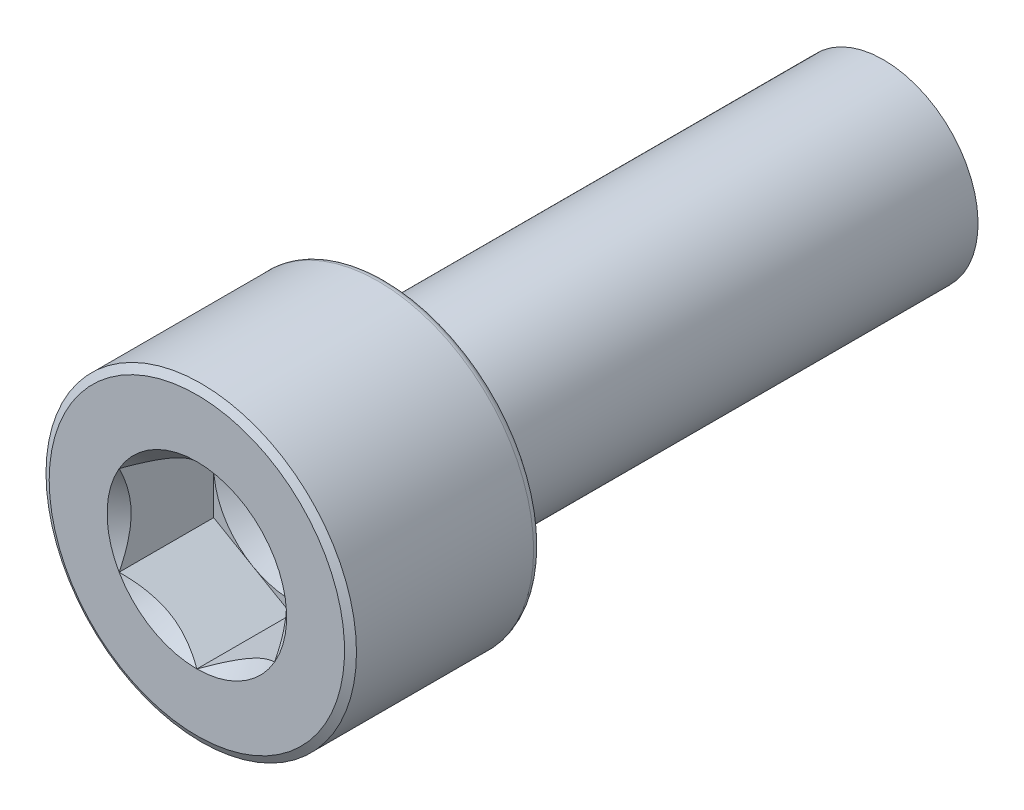
ISO-10303-21;
HEADER;
FILE_DESCRIPTION(('STEP AP214'),'2;1');
FILE_NAME('part.step','',(''),(''),'','','');
FILE_SCHEMA(('AUTOMOTIVE_DESIGN { 1 0 10303 214 1 1 1 1 }'));
ENDSEC;
DATA;
#1=APPLICATION_CONTEXT('core data for automotive mechanical design processes');
#2=APPLICATION_PROTOCOL_DEFINITION('international standard','automotive_design',2000,#1);
#3=PRODUCT_CONTEXT('',#1,'mechanical');
#4=PRODUCT('Part','Part','',(#3));
#5=PRODUCT_RELATED_PRODUCT_CATEGORY('part','',(#4));
#6=PRODUCT_DEFINITION_FORMATION('','',#4);
#7=PRODUCT_DEFINITION_CONTEXT('part definition',#1,'design');
#8=PRODUCT_DEFINITION('design','',#6,#7);
#9=PRODUCT_DEFINITION_SHAPE('','',#8);
#10=(LENGTH_UNIT() NAMED_UNIT(*) SI_UNIT(.MILLI.,.METRE.));
#11=(NAMED_UNIT(*) PLANE_ANGLE_UNIT() SI_UNIT($,.RADIAN.));
#12=(NAMED_UNIT(*) SI_UNIT($,.STERADIAN.) SOLID_ANGLE_UNIT());
#13=UNCERTAINTY_MEASURE_WITH_UNIT(LENGTH_MEASURE(1.E-05),#10,'distance_accuracy_value','');
#14=(GEOMETRIC_REPRESENTATION_CONTEXT(3) GLOBAL_UNCERTAINTY_ASSIGNED_CONTEXT((#13)) GLOBAL_UNIT_ASSIGNED_CONTEXT((#10,
#11,#12)) REPRESENTATION_CONTEXT('',''));
#15=CARTESIAN_POINT('',(0.,0.,0.));
#16=DIRECTION('',(0.,0.,1.));
#17=DIRECTION('',(1.,0.,0.));
#18=AXIS2_PLACEMENT_3D('',#15,#16,#17);
#19=CARTESIAN_POINT('',(1.984375,-3.43703832126949,2.413));
#20=DIRECTION('',(0.,0.,1.));
#21=DIRECTION('',(1.,0.,0.));
#22=AXIS2_PLACEMENT_3D('',#19,#20,#21);
#23=PLANE('',#22);
#24=CARTESIAN_POINT('',(0.,0.,2.413));
#25=DIRECTION('',(0.,0.,1.));
#26=DIRECTION('',(1.,0.,0.));
#27=AXIS2_PLACEMENT_3D('',#24,#25,#26);
#28=CIRCLE('',#27,1.984375);
#29=CARTESIAN_POINT('',(1.984375,0.,2.413));
#30=VERTEX_POINT('',#29);
#31=CARTESIAN_POINT('',(0.992187500000001,1.71851916063475,2.413));
#32=VERTEX_POINT('',#31);
#33=EDGE_CURVE('E52',#30,#32,#28,.T.);
#34=ORIENTED_EDGE('',*,*,#33,.F.);
#35=DIRECTION('',(0.,1.,0.));
#36=VECTOR('',#35,1.);
#37=CARTESIAN_POINT('',(1.984375,-1.14567944042316,2.413));
#38=LINE('',#37,#36);
#39=CARTESIAN_POINT('',(1.98437499999999,1.14567944042319,2.413));
#40=VERTEX_POINT('',#39);
#41=EDGE_CURVE('E122',#30,#40,#38,.T.);
#42=ORIENTED_EDGE('',*,*,#41,.T.);
#43=DIRECTION('',(-0.866025403784439,0.5,0.));
#44=VECTOR('',#43,1.);
#45=CARTESIAN_POINT('',(1.98437499999999,1.14567944042319,2.413));
#46=LINE('',#45,#44);
#47=EDGE_CURVE('E125',#40,#32,#46,.T.);
#48=ORIENTED_EDGE('',*,*,#47,.T.);
#49=EDGE_LOOP('',(#34,#42,#48));
#50=FACE_BOUND('',#49,.T.);
#51=ADVANCED_FACE('F35',(#50),#23,.T.);
#52=CARTESIAN_POINT('',(-0.9921875,1.71851916063475,2.413));
#53=VERTEX_POINT('',#52);
#54=EDGE_CURVE('E11',#32,#53,#28,.T.);
#55=ORIENTED_EDGE('',*,*,#54,.F.);
#56=CARTESIAN_POINT('',(0.,2.29135888084634,2.413));
#57=VERTEX_POINT('',#56);
#58=EDGE_CURVE('E139',#32,#57,#46,.T.);
#59=ORIENTED_EDGE('',*,*,#58,.T.);
#60=DIRECTION('',(-0.866025403784439,-0.499999999999999,0.));
#61=VECTOR('',#60,1.);
#62=CARTESIAN_POINT('',(0.,2.29135888084634,2.413));
#63=LINE('',#62,#61);
#64=EDGE_CURVE('E145',#57,#53,#63,.T.);
#65=ORIENTED_EDGE('',*,*,#64,.T.);
#66=EDGE_LOOP('',(#55,#59,#65));
#67=FACE_BOUND('',#66,.T.);
#68=ADVANCED_FACE('F303',(#67),#23,.T.);
#69=CARTESIAN_POINT('',(-1.984375,0.,2.413));
#70=VERTEX_POINT('',#69);
#71=EDGE_CURVE('E50',#53,#70,#28,.T.);
#72=ORIENTED_EDGE('',*,*,#71,.F.);
#73=CARTESIAN_POINT('',(-1.98437500000001,1.14567944042318,2.413));
#74=VERTEX_POINT('',#73);
#75=EDGE_CURVE('E144',#53,#74,#63,.T.);
#76=ORIENTED_EDGE('',*,*,#75,.T.);
#77=DIRECTION('',(0.,-1.,0.));
#78=VECTOR('',#77,1.);
#79=CARTESIAN_POINT('',(-1.98437500000001,1.14567944042318,2.413));
#80=LINE('',#79,#78);
#81=EDGE_CURVE('E149',#74,#70,#80,.T.);
#82=ORIENTED_EDGE('',*,*,#81,.T.);
#83=EDGE_LOOP('',(#72,#76,#82));
#84=FACE_BOUND('',#83,.T.);
#85=ADVANCED_FACE('F307',(#84),#23,.T.);
#86=CARTESIAN_POINT('',(-0.9921875,-1.71851916063475,2.413));
#87=VERTEX_POINT('',#86);
#88=EDGE_CURVE('E320',#70,#87,#28,.T.);
#89=ORIENTED_EDGE('',*,*,#88,.F.);
#90=CARTESIAN_POINT('',(-1.984375,-1.14567944042316,2.413));
#91=VERTEX_POINT('',#90);
#92=EDGE_CURVE('E148',#70,#91,#80,.T.);
#93=ORIENTED_EDGE('',*,*,#92,.T.);
#94=DIRECTION('',(0.866025403784439,-0.499999999999999,0.));
#95=VECTOR('',#94,1.);
#96=CARTESIAN_POINT('',(-1.984375,-1.14567944042316,2.413));
#97=LINE('',#96,#95);
#98=EDGE_CURVE('E242',#91,#87,#97,.T.);
#99=ORIENTED_EDGE('',*,*,#98,.T.);
#100=EDGE_LOOP('',(#89,#93,#99));
#101=FACE_BOUND('',#100,.T.);
#102=ADVANCED_FACE('F312',(#101),#23,.T.);
#103=CARTESIAN_POINT('',(0.992187499999994,-1.71851916063474,2.413));
#104=VERTEX_POINT('',#103);
#105=EDGE_CURVE('E59',#87,#104,#28,.T.);
#106=ORIENTED_EDGE('',*,*,#105,.F.);
#107=CARTESIAN_POINT('',(0.,-2.29135888084632,2.413));
#108=VERTEX_POINT('',#107);
#109=EDGE_CURVE('E226',#87,#108,#97,.T.);
#110=ORIENTED_EDGE('',*,*,#109,.T.);
#111=DIRECTION('',(0.866025403784439,0.499999999999999,0.));
#112=VECTOR('',#111,1.);
#113=CARTESIAN_POINT('',(0.,-2.29135888084632,2.413));
#114=LINE('',#113,#112);
#115=EDGE_CURVE('E134',#108,#104,#114,.T.);
#116=ORIENTED_EDGE('',*,*,#115,.T.);
#117=EDGE_LOOP('',(#106,#110,#116));
#118=FACE_BOUND('',#117,.T.);
#119=ADVANCED_FACE('F301',(#118),#23,.T.);
#120=CARTESIAN_POINT('',(0.,0.,0.));
#121=DIRECTION('',(0.,0.,-1.));
#122=DIRECTION('',(0.,1.,0.));
#123=AXIS2_PLACEMENT_3D('',#120,#121,#122);
#124=CYLINDRICAL_SURFACE('',#123,2.413);
#125=CARTESIAN_POINT('',(0.,0.,0.));
#126=DIRECTION('',(0.,0.,1.));
#127=DIRECTION('',(1.,0.,0.));
#128=AXIS2_PLACEMENT_3D('',#125,#126,#127);
#129=CIRCLE('',#128,2.413);
#130=CARTESIAN_POINT('',(2.413,0.,0.));
#131=VERTEX_POINT('',#130);
#132=EDGE_CURVE('E156',#131,#131,#129,.F.);
#133=ORIENTED_EDGE('',*,*,#132,.T.);
#134=EDGE_LOOP('',(#133));
#135=FACE_BOUND('',#134,.T.);
#136=CARTESIAN_POINT('',(0.,0.,-12.7));
#137=DIRECTION('',(0.,0.,-1.));
#138=DIRECTION('',(0.,1.,0.));
#139=AXIS2_PLACEMENT_3D('',#136,#137,#138);
#140=CIRCLE('',#139,2.413);
#141=CARTESIAN_POINT('',(0.,2.413,-12.7));
#142=VERTEX_POINT('',#141);
#143=EDGE_CURVE('E170',#142,#142,#140,.T.);
#144=ORIENTED_EDGE('',*,*,#143,.F.);
#145=EDGE_LOOP('',(#144));
#146=FACE_BOUND('',#145,.T.);
#147=ADVANCED_FACE('F324',(#135,#146),#124,.T.);
#148=CARTESIAN_POINT('',(0.,0.,-12.7));
#149=DIRECTION('',(0.,0.,-1.));
#150=DIRECTION('',(0.,1.,0.));
#151=AXIS2_PLACEMENT_3D('',#148,#149,#150);
#152=PLANE('',#151);
#153=ORIENTED_EDGE('',*,*,#143,.T.);
#154=EDGE_LOOP('',(#153));
#155=FACE_BOUND('',#154,.T.);
#156=ADVANCED_FACE('F329',(#155),#152,.T.);
#157=CARTESIAN_POINT('',(0.,0.,4.826));
#158=DIRECTION('',(0.,0.,-1.));
#159=DIRECTION('',(-1.,0.,0.));
#160=AXIS2_PLACEMENT_3D('',#157,#158,#159);
#161=CYLINDRICAL_SURFACE('',#160,3.9624);
#162=CARTESIAN_POINT('',(0.,0.,4.71454830403563));
#163=DIRECTION('',(0.,0.,1.));
#164=DIRECTION('',(1.,0.,0.));
#165=AXIS2_PLACEMENT_3D('',#162,#163,#164);
#166=CIRCLE('',#165,3.9624);
#167=CARTESIAN_POINT('',(-3.9624,0.,4.71454830403563));
#168=VERTEX_POINT('',#167);
#169=EDGE_CURVE('E181',#168,#168,#166,.F.);
#170=ORIENTED_EDGE('',*,*,#169,.T.);
#171=EDGE_LOOP('',(#170));
#172=FACE_BOUND('',#171,.T.);
#173=CARTESIAN_POINT('',(0.,0.,0.19304));
#174=DIRECTION('',(0.,0.,1.));
#175=DIRECTION('',(1.,0.,0.));
#176=AXIS2_PLACEMENT_3D('',#173,#174,#175);
#177=CIRCLE('',#176,3.9624);
#178=CARTESIAN_POINT('',(3.9624,0.,0.19304));
#179=VERTEX_POINT('',#178);
#180=EDGE_CURVE('E173',#179,#179,#177,.T.);
#181=ORIENTED_EDGE('',*,*,#180,.T.);
#182=EDGE_LOOP('',(#181));
#183=FACE_BOUND('',#182,.T.);
#184=ADVANCED_FACE('F403',(#172,#183),#161,.T.);
#185=CARTESIAN_POINT('',(0.,0.,4.826));
#186=DIRECTION('',(0.,0.,1.));
#187=DIRECTION('',(1.,0.,0.));
#188=AXIS2_PLACEMENT_3D('',#185,#186,#187);
#189=PLANE('',#188);
#190=CARTESIAN_POINT('',(0.,0.,4.826));
#191=DIRECTION('',(0.,0.,1.));
#192=DIRECTION('',(1.,0.,0.));
#193=AXIS2_PLACEMENT_3D('',#190,#191,#192);
#194=CIRCLE('',#193,2.29135888084632);
#195=CARTESIAN_POINT('',(1.98437499999999,1.14567944042316,4.826));
#196=VERTEX_POINT('',#195);
#197=CARTESIAN_POINT('',(0.,2.29135888084632,4.826));
#198=VERTEX_POINT('',#197);
#199=EDGE_CURVE('E209',#196,#198,#194,.T.);
#200=ORIENTED_EDGE('',*,*,#199,.F.);
#201=CARTESIAN_POINT('',(1.984375,-1.14567944042316,4.826));
#202=VERTEX_POINT('',#201);
#203=EDGE_CURVE('E202',#202,#196,#194,.T.);
#204=ORIENTED_EDGE('',*,*,#203,.F.);
#205=CARTESIAN_POINT('',(0.,-2.29135888084632,4.826));
#206=VERTEX_POINT('',#205);
#207=EDGE_CURVE('E195',#206,#202,#194,.T.);
#208=ORIENTED_EDGE('',*,*,#207,.F.);
#209=CARTESIAN_POINT('',(-1.984375,-1.14567944042314,4.826));
#210=VERTEX_POINT('',#209);
#211=EDGE_CURVE('E201',#210,#206,#194,.T.);
#212=ORIENTED_EDGE('',*,*,#211,.F.);
#213=CARTESIAN_POINT('',(-1.98437499999997,1.1456794404232,4.826));
#214=VERTEX_POINT('',#213);
#215=EDGE_CURVE('E66',#214,#210,#194,.T.);
#216=ORIENTED_EDGE('',*,*,#215,.F.);
#217=EDGE_CURVE('E217',#198,#214,#194,.T.);
#218=ORIENTED_EDGE('',*,*,#217,.F.);
#219=EDGE_LOOP('',(#200,#204,#208,#212,#216,#218));
#220=FACE_BOUND('',#219,.T.);
#221=CARTESIAN_POINT('',(0.,0.,4.826));
#222=DIRECTION('',(0.,0.,1.));
#223=DIRECTION('',(1.,0.,0.));
#224=AXIS2_PLACEMENT_3D('',#221,#222,#223);
#225=CIRCLE('',#224,3.76936);
#226=CARTESIAN_POINT('',(-3.76936,0.,4.826));
#227=VERTEX_POINT('',#226);
#228=EDGE_CURVE('E179',#227,#227,#225,.T.);
#229=ORIENTED_EDGE('',*,*,#228,.T.);
#230=EDGE_LOOP('',(#229));
#231=FACE_BOUND('',#230,.T.);
#232=ADVANCED_FACE('F212',(#220,#231),#189,.T.);
#233=CARTESIAN_POINT('',(0.,0.,0.));
#234=DIRECTION('',(0.,0.,1.));
#235=DIRECTION('',(1.,0.,0.));
#236=AXIS2_PLACEMENT_3D('',#233,#234,#235);
#237=PLANE('',#236);
#238=CARTESIAN_POINT('',(0.,0.,0.));
#239=DIRECTION('',(0.,0.,1.));
#240=DIRECTION('',(1.,0.,0.));
#241=AXIS2_PLACEMENT_3D('',#238,#239,#240);
#242=CIRCLE('',#241,3.76936);
#243=CARTESIAN_POINT('',(3.76936,0.,0.));
#244=VERTEX_POINT('',#243);
#245=EDGE_CURVE('E176',#244,#244,#242,.F.);
#246=ORIENTED_EDGE('',*,*,#245,.T.);
#247=EDGE_LOOP('',(#246));
#248=FACE_BOUND('',#247,.T.);
#249=ORIENTED_EDGE('',*,*,#132,.F.);
#250=EDGE_LOOP('',(#249));
#251=FACE_BOUND('',#250,.T.);
#252=ADVANCED_FACE('F402',(#248,#251),#237,.F.);
#253=CARTESIAN_POINT('',(0.,0.,0.19304));
#254=DIRECTION('',(0.,0.,1.));
#255=DIRECTION('',(1.,0.,0.));
#256=AXIS2_PLACEMENT_3D('',#253,#254,#255);
#257=TOROIDAL_SURFACE('',#256,3.76936,0.19304);
#258=ORIENTED_EDGE('',*,*,#245,.F.);
#259=EDGE_LOOP('',(#258));
#260=FACE_BOUND('',#259,.T.);
#261=ORIENTED_EDGE('',*,*,#180,.F.);
#262=EDGE_LOOP('',(#261));
#263=FACE_BOUND('',#262,.T.);
#264=ADVANCED_FACE('F414',(#260,#263),#257,.T.);
#265=CARTESIAN_POINT('',(0.,0.,4.826));
#266=DIRECTION('',(0.,0.,-1.));
#267=DIRECTION('',(-1.,0.,0.));
#268=AXIS2_PLACEMENT_3D('',#265,#266,#267);
#269=CONICAL_SURFACE('',#268,3.76936,1.0471975511966);
#270=CARTESIAN_POINT('',(-3.9624,0.,4.71454830403563));
#271=CARTESIAN_POINT('',(-3.96038916666667,0.,4.71570925920193));
#272=CARTESIAN_POINT('',(-3.95837833333333,0.,4.71687021436822));
#273=CARTESIAN_POINT('',(-3.95435666666667,0.,4.71919212470081));
#274=CARTESIAN_POINT('',(-3.95234583333333,0.,4.72035307986711));
#275=CARTESIAN_POINT('',(-3.94832416666667,0.,4.7226749901997));
#276=CARTESIAN_POINT('',(-3.94631333333333,0.,4.723835945366));
#277=CARTESIAN_POINT('',(-3.94229166666667,0.,4.72615785569859));
#278=CARTESIAN_POINT('',(-3.94028083333333,0.,4.72731881086488));
#279=CARTESIAN_POINT('',(-3.93625916666667,0.,4.72964072119747));
#280=CARTESIAN_POINT('',(-3.93424833333333,0.,4.73080167636377));
#281=CARTESIAN_POINT('',(-3.93022666666667,0.,4.73312358669636));
#282=CARTESIAN_POINT('',(-3.92821583333333,0.,4.73428454186266));
#283=CARTESIAN_POINT('',(-3.92419416666667,0.,4.73660645219525));
#284=CARTESIAN_POINT('',(-3.92218333333333,0.,4.73776740736154));
#285=CARTESIAN_POINT('',(-3.91816166666667,0.,4.74008931769413));
#286=CARTESIAN_POINT('',(-3.91615083333333,0.,4.74125027286043));
#287=CARTESIAN_POINT('',(-3.91212916666667,0.,4.74357218319302));
#288=CARTESIAN_POINT('',(-3.91011833333333,0.,4.74473313835931));
#289=CARTESIAN_POINT('',(-3.90609666666667,0.,4.74705504869191));
#290=CARTESIAN_POINT('',(-3.90408583333333,0.,4.7482160038582));
#291=CARTESIAN_POINT('',(-3.90006416666667,0.,4.75053791419079));
#292=CARTESIAN_POINT('',(-3.89805333333333,0.,4.75169886935709));
#293=CARTESIAN_POINT('',(-3.89403166666667,0.,4.75402077968968));
#294=CARTESIAN_POINT('',(-3.89202083333333,0.,4.75518173485597));
#295=CARTESIAN_POINT('',(-3.88799916666667,0.,4.75750364518857));
#296=CARTESIAN_POINT('',(-3.88598833333333,0.,4.75866460035486));
#297=CARTESIAN_POINT('',(-3.88196666666667,0.,4.76098651068745));
#298=CARTESIAN_POINT('',(-3.87995583333333,0.,4.76214746585375));
#299=CARTESIAN_POINT('',(-3.87593416666667,0.,4.76446937618634));
#300=CARTESIAN_POINT('',(-3.87392333333333,0.,4.76563033135263));
#301=CARTESIAN_POINT('',(-3.86990166666667,0.,4.76795224168522));
#302=CARTESIAN_POINT('',(-3.86789083333333,0.,4.76911319685152));
#303=CARTESIAN_POINT('',(-3.86386916666667,0.,4.77143510718411));
#304=CARTESIAN_POINT('',(-3.86185833333333,0.,4.77259606235041));
#305=CARTESIAN_POINT('',(-3.85783666666667,0.,4.774917972683));
#306=CARTESIAN_POINT('',(-3.85582583333333,0.,4.77607892784929));
#307=CARTESIAN_POINT('',(-3.85180416666667,0.,4.77840083818188));
#308=CARTESIAN_POINT('',(-3.84979333333333,0.,4.77956179334818));
#309=CARTESIAN_POINT('',(-3.84577166666667,0.,4.78188370368077));
#310=CARTESIAN_POINT('',(-3.84376083333333,0.,4.78304465884707));
#311=CARTESIAN_POINT('',(-3.83973916666667,0.,4.78536656917966));
#312=CARTESIAN_POINT('',(-3.83772833333333,0.,4.78652752434595));
#313=CARTESIAN_POINT('',(-3.83370666666667,0.,4.78884943467854));
#314=CARTESIAN_POINT('',(-3.83169583333333,0.,4.79001038984484));
#315=CARTESIAN_POINT('',(-3.82767416666667,0.,4.79233230017743));
#316=CARTESIAN_POINT('',(-3.82566333333333,0.,4.79349325534373));
#317=CARTESIAN_POINT('',(-3.82164166666667,0.,4.79581516567632));
#318=CARTESIAN_POINT('',(-3.81963083333333,0.,4.79697612084261));
#319=CARTESIAN_POINT('',(-3.81560916666667,0.,4.7992980311752));
#320=CARTESIAN_POINT('',(-3.81359833333333,0.,4.8004589863415));
#321=CARTESIAN_POINT('',(-3.80957666666667,0.,4.80278089667409));
#322=CARTESIAN_POINT('',(-3.80756583333333,0.,4.80394185184038));
#323=CARTESIAN_POINT('',(-3.80354416666667,0.,4.80626376217298));
#324=CARTESIAN_POINT('',(-3.80153333333333,0.,4.80742471733927));
#325=CARTESIAN_POINT('',(-3.79751166666667,0.,4.80974662767186));
#326=CARTESIAN_POINT('',(-3.79550083333333,0.,4.81090758283816));
#327=CARTESIAN_POINT('',(-3.79147916666667,0.,4.81322949317075));
#328=CARTESIAN_POINT('',(-3.78946833333333,0.,4.81439044833704));
#329=CARTESIAN_POINT('',(-3.78544666666667,0.,4.81671235866964));
#330=CARTESIAN_POINT('',(-3.78343583333333,0.,4.81787331383593));
#331=CARTESIAN_POINT('',(-3.77941416666667,0.,4.82019522416852));
#332=CARTESIAN_POINT('',(-3.77740333333333,0.,4.82135617933482));
#333=CARTESIAN_POINT('',(-3.77338166666667,0.,4.82367808966741));
#334=CARTESIAN_POINT('',(-3.77137083333333,0.,4.8248390448337));
#335=CARTESIAN_POINT('',(-3.76936,0.,4.826));
#336=B_SPLINE_CURVE_WITH_KNOTS('',3,(#270,#271,#272,#273,#274,#275,#276,#277,#278,#279,#280,
#281,#282,#283,#284,#285,#286,#287,#288,#289,#290,#291,#292,#293,#294,#295,#296,#297,#298,#299,
#300,#301,#302,#303,#304,#305,#306,#307,#308,#309,#310,#311,#312,#313,#314,#315,#316,#317,#318,
#319,#320,#321,#322,#323,#324,#325,#326,#327,#328,#329,#330,#331,#332,#333,#334,#335),
.UNSPECIFIED.,.F.,.F.,(4,2,2,2,2,2,2,2,2,2,2,2,2,2,2,2,2,2,2,2,2,2,2,2,2,2,2,2,2,2,2,2,4),(0.,
0.00696573099777281,0.0139314619955456,0.0208971929933188,0.0278629239910909,0.0348286549888641,
0.0417943859866369,0.0487601169844102,0.055725847982183,0.0626915789799558,0.0696573099777286,
0.0766230409755015,0.0835887719732743,0.0905545029710471,0.0975202339688204,0.104485964966593,
0.111451695964366,0.118417426962139,0.125383157959912,0.132348888957685,0.139314619955457,
0.146280350953231,0.153246081951003,0.160211812948776,0.167177543946549,0.174143274944321,
0.181109005942095,0.188074736939868,0.195040467937641,0.202006198935413,0.208971929933186,
0.215937660930959,0.222903391928732),.UNSPECIFIED.);
#337=EDGE_CURVE('BSEAM37',#168,#227,#336,.T.);
#338=ORIENTED_EDGE('',*,*,#169,.F.);
#339=ORIENTED_EDGE('',*,*,#228,.F.);
#340=ORIENTED_EDGE('',*,*,#337,.T.);
#341=ORIENTED_EDGE('',*,*,#337,.F.);
#342=EDGE_LOOP('',(#338,#340,#339,#341));
#343=FACE_BOUND('',#342,.T.);
#344=ADVANCED_FACE('F37',(#343),#269,.T.);
#345=CARTESIAN_POINT('',(0.,0.,4.826));
#346=DIRECTION('',(0.,0.,1.));
#347=DIRECTION('',(1.,0.,0.));
#348=AXIS2_PLACEMENT_3D('',#345,#346,#347);
#349=CONICAL_SURFACE('',#348,2.29135888084632,0.78539816339745);
#350=ORIENTED_EDGE('',*,*,#207,.T.);
#351=CARTESIAN_POINT('',(-0.000200000000006322,-2.29147435090016,4.82611547878184));
#352=CARTESIAN_POINT('',(0.0680159951667959,-2.25208982772757,4.78676285226391));
#353=CARTESIAN_POINT('',(0.137372685106959,-2.21204672412051,4.74972131044618));
#354=CARTESIAN_POINT('',(0.278798800452181,-2.1303943183555,4.68189885842332));
#355=CARTESIAN_POINT('',(0.350881678736776,-2.08877724917393,4.65115568909175));
#356=CARTESIAN_POINT('',(0.496233397265998,-2.00485839535391,4.59849188881121));
#357=CARTESIAN_POINT('',(0.569465212486932,-1.96257798712286,4.57643887587996));
#358=CARTESIAN_POINT('',(0.7175411825947,-1.87708628592062,4.54246149294387));
#359=CARTESIAN_POINT('',(0.792380812753419,-1.83387760530244,4.53051175609173));
#360=CARTESIAN_POINT('',(0.92136041454381,-1.75941119748878,4.5197300990819));
#361=CARTESIAN_POINT('',(0.975333715772437,-1.72824969749538,4.51813389905907));
#362=CARTESIAN_POINT('',(1.08319211851979,-1.66597761963483,4.52082183886529));
#363=CARTESIAN_POINT('',(1.13707718248552,-1.63486706344892,4.52510804034046));
#364=CARTESIAN_POINT('',(1.2443385382486,-1.57293969082546,4.53931687301352));
#365=CARTESIAN_POINT('',(1.29771419276013,-1.54212324232506,4.54924581045227));
#366=CARTESIAN_POINT('',(1.40354251740889,-1.48102323060121,4.57419508427454));
#367=CARTESIAN_POINT('',(1.45599525797109,-1.45073962671789,4.58921503038949));
#368=CARTESIAN_POINT('',(1.59035733896364,-1.37316564308796,4.63380785163567));
#369=CARTESIAN_POINT('',(1.67143335715832,-1.32635638215844,4.66674299593833));
#370=CARTESIAN_POINT('',(1.79064830672983,-1.2575275989319,4.7223424412022));
#371=CARTESIAN_POINT('',(1.829934924386,-1.23484545965257,4.74187759205186));
#372=CARTESIAN_POINT('',(1.90778036186805,-1.18990137536712,4.7827287381194));
#373=CARTESIAN_POINT('',(1.94633961110169,-1.16763918244232,4.80404363956835));
#374=CARTESIAN_POINT('',(1.984575,-1.14556397036932,4.82611547878184));
#375=B_SPLINE_CURVE_WITH_KNOTS('',3,(#351,#352,#353,#354,#355,#356,#357,#358,#359,#360,#361,
#362,#363,#364,#365,#366,#367,#368,#369,#370,#371,#372,#373,#374),.UNSPECIFIED.,.F.,.F.,(4,2,2,
2,2,2,2,2,2,2,2,4),(0.,0.264339630306627,0.530219665093694,0.791876416371461,1.05287424418109,
1.239639843932,1.42647091743852,1.61351120244035,1.8005371524754,2.09764209964316,
2.24579179873714,2.39385111134157),.UNSPECIFIED.);
#376=EDGE_CURVE('E39',#206,#202,#375,.T.);
#377=ORIENTED_EDGE('',*,*,#376,.F.);
#378=EDGE_LOOP('',(#350,#377));
#379=FACE_BOUND('',#378,.T.);
#380=ADVANCED_FACE('F197',(#379),#349,.F.);
#381=ORIENTED_EDGE('',*,*,#203,.T.);
#382=CARTESIAN_POINT('',(1.984375,-2.28495242191065,5.56098407906757));
#383=CARTESIAN_POINT('',(1.984375,-2.22931635487712,5.51898668579209));
#384=CARTESIAN_POINT('',(1.984375,-2.17336876579764,5.47739605430801));
#385=CARTESIAN_POINT('',(1.984375,-2.06072770287665,5.39520846168391));
#386=CARTESIAN_POINT('',(1.984375,-2.00403404531983,5.35461175260787));
#387=CARTESIAN_POINT('',(1.984375,-1.88936329200115,5.27430350335824));
#388=CARTESIAN_POINT('',(1.984375,-1.83137965544998,5.23460125898722));
#389=CARTESIAN_POINT('',(1.984375,-1.71442802161517,5.15668517355603));
#390=CARTESIAN_POINT('',(1.984375,-1.6554600942991,5.11847122733961));
#391=CARTESIAN_POINT('',(1.984375,-1.47005472325434,5.0022528341287));
#392=CARTESIAN_POINT('',(1.984375,-1.34163909444948,4.92734788696727));
#393=CARTESIAN_POINT('',(1.984375,-1.07840384717677,4.79033021549721));
#394=CARTESIAN_POINT('',(1.984375,-0.943607781504087,4.72817436652259));
#395=CARTESIAN_POINT('',(1.984375,-0.7412751005225,4.65213257871602));
#396=CARTESIAN_POINT('',(1.984375,-0.676735408966689,4.63030806135391));
#397=CARTESIAN_POINT('',(1.984375,-0.546098118214568,4.59184046356508));
#398=CARTESIAN_POINT('',(1.984375,-0.480000412029999,4.57519774009172));
#399=CARTESIAN_POINT('',(1.984375,-0.347746170154777,4.5482353808918));
#400=CARTESIAN_POINT('',(1.984375,-0.28161207161333,4.53780740975504));
#401=CARTESIAN_POINT('',(1.984375,-0.148636620202213,4.52347814738807));
#402=CARTESIAN_POINT('',(1.98437499999999,-0.0817953908968818,4.51957573423413));
#403=CARTESIAN_POINT('',(1.98437499999999,0.0495156749173089,4.51858705132861));
#404=CARTESIAN_POINT('',(1.98437499999999,0.113983774924714,4.52125917886497));
#405=CARTESIAN_POINT('',(1.98437499999999,0.242367515655507,4.53273921047457));
#406=CARTESIAN_POINT('',(1.98437499999999,0.306283102099379,4.54154771060935));
#407=CARTESIAN_POINT('',(1.98437499999999,0.434181040054056,4.56496902128854));
#408=CARTESIAN_POINT('',(1.98437499999999,0.498145026644481,4.57968060618011));
#409=CARTESIAN_POINT('',(1.98437499999999,0.624675616728328,4.61412618134473));
#410=CARTESIAN_POINT('',(1.98437499999999,0.687242336669859,4.63385975137401));
#411=CARTESIAN_POINT('',(1.98437499999999,0.884225483546212,4.70341223711885));
#412=CARTESIAN_POINT('',(1.98437499999999,1.01583674224242,4.7611524111108));
#413=CARTESIAN_POINT('',(1.98437499999999,1.27288659202273,4.88953033637179));
#414=CARTESIAN_POINT('',(1.98437499999999,1.3983008822619,4.96021442466487));
#415=CARTESIAN_POINT('',(1.98437499999999,1.57956687940504,5.07051666350364));
#416=CARTESIAN_POINT('',(1.98437499999999,1.63738271248118,5.10696982914889));
#417=CARTESIAN_POINT('',(1.98437499999999,1.75202215331741,5.18141596293131));
#418=CARTESIAN_POINT('',(1.98437499999999,1.80884568545336,5.21940904770067));
#419=CARTESIAN_POINT('',(1.98437499999999,1.92116923025136,5.29633880848191));
#420=CARTESIAN_POINT('',(1.98437499999999,1.97667624451606,5.33526531261081));
#421=CARTESIAN_POINT('',(1.98437499999999,2.08693170653472,5.41414774565983));
#422=CARTESIAN_POINT('',(1.98437499999999,2.14168035869581,5.45410338854569));
#423=CARTESIAN_POINT('',(1.98437499999999,2.19611148979895,5.49448061079033));
#424=B_SPLINE_CURVE_WITH_KNOTS('',3,(#382,#383,#384,#385,#386,#387,#388,#389,#390,#391,#392,
#393,#394,#395,#396,#397,#398,#399,#400,#401,#402,#403,#404,#405,#406,#407,#408,#409,#410,#411,
#412,#413,#414,#415,#416,#417,#418,#419,#420,#421,#422,#423),.UNSPECIFIED.,.F.,.F.,(4,2,2,2,2,2,
2,2,2,2,2,2,2,2,2,2,2,2,2,2,4),(0.,0.209126070048126,0.418304637436189,0.629103980098174,
0.839888401531923,1.28549951141298,1.72957750802532,1.93379389781846,2.1380243521627,
2.33858179541697,2.53910475375794,2.73236963423928,2.92565329027997,3.1223157711642,
3.318961800581,3.74886295246279,4.18033428110717,4.38536017158906,4.5904016196826,
4.79377749130337,4.99709743482714),.UNSPECIFIED.);
#425=EDGE_CURVE('E205',#202,#196,#424,.T.);
#426=ORIENTED_EDGE('',*,*,#425,.F.);
#427=EDGE_LOOP('',(#381,#426));
#428=FACE_BOUND('',#427,.T.);
#429=ADVANCED_FACE('F206',(#428),#349,.F.);
#430=ORIENTED_EDGE('',*,*,#199,.T.);
#431=CARTESIAN_POINT('',(1.98457499999999,1.14556397036935,4.82611547878186));
#432=CARTESIAN_POINT('',(1.91635900483319,1.18494849354194,4.78676285226393));
#433=CARTESIAN_POINT('',(1.84700231489303,1.22499159714899,4.7497213104462));
#434=CARTESIAN_POINT('',(1.70557619954781,1.306644002914,4.68189885842334));
#435=CARTESIAN_POINT('',(1.63349332126322,1.34826107209557,4.65115568909177));
#436=CARTESIAN_POINT('',(1.488141602734,1.43217992591559,4.59849188881123));
#437=CARTESIAN_POINT('',(1.41490978751306,1.47446033414664,4.57643887587998));
#438=CARTESIAN_POINT('',(1.2668338174053,1.55995203534888,4.5424614929439));
#439=CARTESIAN_POINT('',(1.19199418724658,1.60316071596706,4.53051175609175));
#440=CARTESIAN_POINT('',(1.06301458545619,1.67762712378072,4.51973009908193));
#441=CARTESIAN_POINT('',(1.00904128422756,1.70878862377412,4.51813389905909));
#442=CARTESIAN_POINT('',(0.901182881480204,1.77106070163467,4.52082183886532));
#443=CARTESIAN_POINT('',(0.847297817514481,1.80217125782058,4.52510804034048));
#444=CARTESIAN_POINT('',(0.7400364617514,1.86409863044404,4.53931687301354));
#445=CARTESIAN_POINT('',(0.686660807239863,1.89491507894445,4.5492458104523));
#446=CARTESIAN_POINT('',(0.580832482591106,1.95601509066829,4.57419508427456));
#447=CARTESIAN_POINT('',(0.528379742028901,1.98629869455162,4.58921503038951));
#448=CARTESIAN_POINT('',(0.394017661036354,2.06387267818154,4.6338078516357));
#449=CARTESIAN_POINT('',(0.312941642841679,2.11068193911106,4.66674299593836));
#450=CARTESIAN_POINT('',(0.193726693270164,2.1795107223376,4.72234244120222));
#451=CARTESIAN_POINT('',(0.154440075614002,2.20219286161694,4.74187759205189));
#452=CARTESIAN_POINT('',(0.0765946381319506,2.24713694590238,4.78272873811943));
#453=CARTESIAN_POINT('',(0.038035388898305,2.26939913882718,4.80404363956838));
#454=CARTESIAN_POINT('',(-0.000199999999996157,2.29147435090018,4.82611547878187));
#455=B_SPLINE_CURVE_WITH_KNOTS('',3,(#431,#432,#433,#434,#435,#436,#437,#438,#439,#440,#441,
#442,#443,#444,#445,#446,#447,#448,#449,#450,#451,#452,#453,#454),.UNSPECIFIED.,.F.,.F.,(4,2,2,
2,2,2,2,2,2,2,2,4),(0.,0.264339630306622,0.530219665093684,0.791876416371446,1.05287424418107,
1.23963984393198,1.42647091743851,1.61351120244033,1.80053715247539,2.09764209964315,
2.24579179873712,2.39385111134156),.UNSPECIFIED.);
#456=EDGE_CURVE('E208',#196,#198,#455,.T.);
#457=ORIENTED_EDGE('',*,*,#456,.F.);
#458=EDGE_LOOP('',(#430,#457));
#459=FACE_BOUND('',#458,.T.);
#460=ADVANCED_FACE('F371',(#459),#349,.F.);
#461=ORIENTED_EDGE('',*,*,#217,.T.);
#462=CARTESIAN_POINT('',(0.000200000000003965,2.29147435090018,4.82611547878187));
#463=CARTESIAN_POINT('',(-0.0680159951667988,2.25208982772759,4.78676285226394));
#464=CARTESIAN_POINT('',(-0.137372685106963,2.21204672412054,4.74972131044621));
#465=CARTESIAN_POINT('',(-0.278798800452186,2.13039431835553,4.68189885842335));
#466=CARTESIAN_POINT('',(-0.350881678736782,2.08877724917395,4.65115568909178));
#467=CARTESIAN_POINT('',(-0.496233397266004,2.00485839535393,4.59849188881124));
#468=CARTESIAN_POINT('',(-0.569465212486939,1.96257798712288,4.57643887587999));
#469=CARTESIAN_POINT('',(-0.717541182594708,1.87708628592065,4.5424614929439));
#470=CARTESIAN_POINT('',(-0.792380812753427,1.83387760530246,4.53051175609175));
#471=CARTESIAN_POINT('',(-0.92136041454382,1.7594111974888,4.51973009908193));
#472=CARTESIAN_POINT('',(-0.975333715772447,1.7282496974954,4.51813389905909));
#473=CARTESIAN_POINT('',(-1.08319211851981,1.66597761963485,4.52082183886531));
#474=CARTESIAN_POINT('',(-1.13707718248553,1.63486706344894,4.52510804034048));
#475=CARTESIAN_POINT('',(-1.24433853824861,1.57293969082548,4.53931687301354));
#476=CARTESIAN_POINT('',(-1.29771419276015,1.54212324232507,4.54924581045229));
#477=CARTESIAN_POINT('',(-1.4035425174089,1.48102323060123,4.57419508427456));
#478=CARTESIAN_POINT('',(-1.45599525797111,1.4507396267179,4.58921503038951));
#479=CARTESIAN_POINT('',(-1.59035733896366,1.37316564308798,4.63380785163569));
#480=CARTESIAN_POINT('',(-1.67143335715833,1.32635638215846,4.66674299593835));
#481=CARTESIAN_POINT('',(-1.79064830672985,1.25752759893192,4.72234244120222));
#482=CARTESIAN_POINT('',(-1.82993492438601,1.23484545965258,4.74187759205188));
#483=CARTESIAN_POINT('',(-1.90778036186806,1.18990137536714,4.78272873811942));
#484=CARTESIAN_POINT('',(-1.94633961110171,1.16763918244234,4.80404363956837));
#485=CARTESIAN_POINT('',(-1.98457500000001,1.14556397036934,4.82611547878186));
#486=B_SPLINE_CURVE_WITH_KNOTS('',3,(#462,#463,#464,#465,#466,#467,#468,#469,#470,#471,#472,
#473,#474,#475,#476,#477,#478,#479,#480,#481,#482,#483,#484,#485),.UNSPECIFIED.,.F.,.F.,(4,2,2,
2,2,2,2,2,2,2,2,4),(0.,0.264339630306629,0.530219665093698,0.791876416371466,1.0528742441811,
1.23963984393201,1.42647091743853,1.61351120244036,1.80053715247542,2.09764209964318,
2.24579179873715,2.39385111134158),.UNSPECIFIED.);
#487=EDGE_CURVE('E237',#198,#214,#486,.T.);
#488=ORIENTED_EDGE('',*,*,#487,.F.);
#489=EDGE_LOOP('',(#461,#488));
#490=FACE_BOUND('',#489,.T.);
#491=ADVANCED_FACE('F363',(#490),#349,.F.);
#492=ORIENTED_EDGE('',*,*,#215,.T.);
#493=CARTESIAN_POINT('',(-1.984375,-2.2849524215782,5.56098407881656));
#494=CARTESIAN_POINT('',(-1.984375,-2.229316354554,5.51898668555076));
#495=CARTESIAN_POINT('',(-1.984375,-2.17336876548387,5.47739605407633));
#496=CARTESIAN_POINT('',(-1.984375,-2.06072770258169,5.39520846147148));
#497=CARTESIAN_POINT('',(-1.984375,-2.00403404503433,5.35461175240504));
#498=CARTESIAN_POINT('',(-1.984375,-1.88936329173487,5.27430350317467));
#499=CARTESIAN_POINT('',(-1.984375,-1.83137965519346,5.23460125881331));
#500=CARTESIAN_POINT('',(-1.984375,-1.71442802137839,5.15668517340129));
#501=CARTESIAN_POINT('',(-1.984375,-1.65546009407226,5.11847122719437));
#502=CARTESIAN_POINT('',(-1.984375,-1.47005472306034,5.00225283401364));
#503=CARTESIAN_POINT('',(-1.984375,-1.34163909427882,4.92734788687238));
#504=CARTESIAN_POINT('',(-1.984375,-1.07840384705479,4.79033021543974));
#505=CARTESIAN_POINT('',(-1.984375,-0.943607781407415,4.72817436648238));
#506=CARTESIAN_POINT('',(-1.984375,-0.741275100444874,4.65213257868863));
#507=CARTESIAN_POINT('',(-1.984375,-0.676735408881088,4.63030806132601));
#508=CARTESIAN_POINT('',(-1.984375,-0.546098118112755,4.5918404635378));
#509=CARTESIAN_POINT('',(-1.984375,-0.480000411919949,4.57519774006556));
#510=CARTESIAN_POINT('',(-1.984375,-0.347746170028525,4.54823538086973));
#511=CARTESIAN_POINT('',(-1.984375,-0.281612071479117,4.5378074097359));
#512=CARTESIAN_POINT('',(-1.984375,-0.148636620052345,4.52347814737661));
#513=CARTESIAN_POINT('',(-1.98437500000001,-0.0817953907393189,4.5195757342274));
#514=CARTESIAN_POINT('',(-1.98437500000001,0.0495156750890684,4.51858705133269));
#515=CARTESIAN_POINT('',(-1.98437500000001,0.113983775102995,4.52125917887503));
#516=CARTESIAN_POINT('',(-1.98437500000001,0.24236751584618,4.53273921049753));
#517=CARTESIAN_POINT('',(-1.98437500000001,0.306283102295922,4.54154771063923));
#518=CARTESIAN_POINT('',(-1.98437500000001,0.434181040262186,4.56496902133291));
#519=CARTESIAN_POINT('',(-1.98437500000001,0.498145026858312,4.5796806062321));
#520=CARTESIAN_POINT('',(-1.98437500000001,0.624675616953009,4.61412618141214));
#521=CARTESIAN_POINT('',(-1.98437500000001,0.68724233689969,4.63385975144921));
#522=CARTESIAN_POINT('',(-1.98437500000001,0.88422548382609,4.70341223723077));
#523=CARTESIAN_POINT('',(-1.98437500000001,1.01583674256468,4.76115241125651));
#524=CARTESIAN_POINT('',(-1.98437500000001,1.27288659242652,4.88953033658881));
#525=CARTESIAN_POINT('',(-1.98437500000001,1.3983008827048,4.96021442491943));
#526=CARTESIAN_POINT('',(-1.98437500000001,1.57956687990222,5.07051666381322));
#527=CARTESIAN_POINT('',(-1.98437500000001,1.63738271299424,5.10696982947538));
#528=CARTESIAN_POINT('',(-1.98437500000001,1.75202215386202,5.18141596329172));
#529=CARTESIAN_POINT('',(-1.98437500000001,1.80884568601362,5.21940904807807));
#530=CARTESIAN_POINT('',(-1.98437500000001,1.92116923084256,5.29633880889311));
#531=CARTESIAN_POINT('',(-1.98437500000001,1.97667624512254,5.33526531303881));
#532=CARTESIAN_POINT('',(-1.98437500000001,2.08693170717167,5.41414774612141));
#533=CARTESIAN_POINT('',(-1.98437500000001,2.14168035934793,5.45410338902405));
#534=CARTESIAN_POINT('',(-1.98437500000001,2.19611149046623,5.49448061128545));
#535=B_SPLINE_CURVE_WITH_KNOTS('',3,(#493,#494,#495,#496,#497,#498,#499,#500,#501,#502,#503,
#504,#505,#506,#507,#508,#509,#510,#511,#512,#513,#514,#515,#516,#517,#518,#519,#520,#521,#522,
#523,#524,#525,#526,#527,#528,#529,#530,#531,#532,#533,#534),.UNSPECIFIED.,.F.,.F.,(4,2,2,2,2,2,
2,2,2,2,2,2,2,2,2,2,2,2,2,2,4),(0.,0.20912607000832,0.418304637356565,0.629103979977986,
0.839888401371177,1.28549951116126,1.72957750768349,1.9337938974997,2.13802435186696,
2.33858179514332,2.53910475350637,2.73236963400792,2.92565329006884,3.12231577097485,
3.31896180041342,3.7488629524517,4.1803342812536,4.38536017180288,4.59040161996381,
4.79377749165106,4.9970974352413),.UNSPECIFIED.);
#536=EDGE_CURVE('E227',#214,#210,#535,.F.);
#537=ORIENTED_EDGE('',*,*,#536,.F.);
#538=EDGE_LOOP('',(#492,#537));
#539=FACE_BOUND('',#538,.T.);
#540=ADVANCED_FACE('F262',(#539),#349,.F.);
#541=ORIENTED_EDGE('',*,*,#211,.T.);
#542=CARTESIAN_POINT('',(-1.984575,-1.14556397036932,4.82611547878185));
#543=CARTESIAN_POINT('',(-1.9163590048332,-1.18494849354191,4.78676285226392));
#544=CARTESIAN_POINT('',(-1.84700231489304,-1.22499159714897,4.74972131044619));
#545=CARTESIAN_POINT('',(-1.70557619954781,-1.30664400291398,4.68189885842333));
#546=CARTESIAN_POINT('',(-1.63349332126322,-1.34826107209555,4.65115568909176));
#547=CARTESIAN_POINT('',(-1.488141602734,-1.43217992591557,4.59849188881122));
#548=CARTESIAN_POINT('',(-1.41490978751306,-1.47446033414662,4.57643887587997));
#549=CARTESIAN_POINT('',(-1.26683381740529,-1.55995203534886,4.54246149294388));
#550=CARTESIAN_POINT('',(-1.19199418724657,-1.60316071596705,4.53051175609173));
#551=CARTESIAN_POINT('',(-1.06301458545618,-1.6776271237807,4.51973009908191));
#552=CARTESIAN_POINT('',(-1.00904128422756,-1.7087886237741,4.51813389905907));
#553=CARTESIAN_POINT('',(-0.901182881480199,-1.77106070163465,4.5208218388653));
#554=CARTESIAN_POINT('',(-0.847297817514476,-1.80217125782056,4.52510804034046));
#555=CARTESIAN_POINT('',(-0.740036461751395,-1.86409863044402,4.53931687301352));
#556=CARTESIAN_POINT('',(-0.686660807239858,-1.89491507894443,4.54924581045228));
#557=CARTESIAN_POINT('',(-0.580832482591102,-1.95601509066827,4.57419508427454));
#558=CARTESIAN_POINT('',(-0.528379742028897,-1.9862986945516,4.58921503038949));
#559=CARTESIAN_POINT('',(-0.394017661036351,-2.06387267818152,4.63380785163567));
#560=CARTESIAN_POINT('',(-0.312941642841677,-2.11068193911104,4.66674299593834));
#561=CARTESIAN_POINT('',(-0.193726693270164,-2.17951072233758,4.7223424412022));
#562=CARTESIAN_POINT('',(-0.154440075614002,-2.20219286161691,4.74187759205186));
#563=CARTESIAN_POINT('',(-0.0765946381319519,-2.24713694590236,4.7827287381194));
#564=CARTESIAN_POINT('',(-0.0380353888983069,-2.26939913882715,4.80404363956835));
#565=CARTESIAN_POINT('',(0.000199999999993677,-2.29147435090016,4.82611547878184));
#566=B_SPLINE_CURVE_WITH_KNOTS('',3,(#542,#543,#544,#545,#546,#547,#548,#549,#550,#551,#552,
#553,#554,#555,#556,#557,#558,#559,#560,#561,#562,#563,#564,#565),.UNSPECIFIED.,.F.,.F.,(4,2,2,
2,2,2,2,2,2,2,2,4),(0.,0.264339630306629,0.530219665093698,0.791876416371465,1.0528742441811,
1.23963984393201,1.42647091743853,1.61351120244035,1.80053715247541,2.09764209964316,
2.24579179873713,2.39385111134157),.UNSPECIFIED.);
#567=EDGE_CURVE('E223',#210,#206,#566,.T.);
#568=ORIENTED_EDGE('',*,*,#567,.F.);
#569=EDGE_LOOP('',(#541,#568));
#570=FACE_BOUND('',#569,.T.);
#571=ADVANCED_FACE('F222',(#570),#349,.F.);
#572=EDGE_CURVE('E112',#104,#30,#28,.T.);
#573=ORIENTED_EDGE('',*,*,#572,.F.);
#574=CARTESIAN_POINT('',(1.984375,-1.14567944042316,2.413));
#575=VERTEX_POINT('',#574);
#576=EDGE_CURVE('E137',#104,#575,#114,.T.);
#577=ORIENTED_EDGE('',*,*,#576,.T.);
#578=EDGE_CURVE('E130',#575,#30,#38,.T.);
#579=ORIENTED_EDGE('',*,*,#578,.T.);
#580=EDGE_LOOP('',(#573,#577,#579));
#581=FACE_BOUND('',#580,.T.);
#582=ADVANCED_FACE('F136',(#581),#23,.T.);
#583=CARTESIAN_POINT('',(0.,-2.29135888084632,2.413));
#584=DIRECTION('',(0.499999999999999,-0.866025403784439,0.));
#585=DIRECTION('',(0.866025403784439,0.499999999999999,0.));
#586=AXIS2_PLACEMENT_3D('',#583,#584,#585);
#587=PLANE('',#586);
#588=DIRECTION('',(0.,0.,1.));
#589=VECTOR('',#588,1.);
#590=CARTESIAN_POINT('',(0.,-2.29135888084632,2.413));
#591=LINE('',#590,#589);
#592=EDGE_CURVE('E152',#108,#206,#591,.T.);
#593=ORIENTED_EDGE('',*,*,#592,.T.);
#594=ORIENTED_EDGE('',*,*,#376,.T.);
#595=DIRECTION('',(0.,0.,1.));
#596=VECTOR('',#595,1.);
#597=CARTESIAN_POINT('',(1.984375,-1.14567944042316,2.413));
#598=LINE('',#597,#596);
#599=EDGE_CURVE('E164',#575,#202,#598,.T.);
#600=ORIENTED_EDGE('',*,*,#599,.F.);
#601=ORIENTED_EDGE('',*,*,#576,.F.);
#602=ORIENTED_EDGE('',*,*,#115,.F.);
#603=EDGE_LOOP('',(#593,#594,#600,#601,#602));
#604=FACE_BOUND('',#603,.T.);
#605=ADVANCED_FACE('F189',(#604),#587,.F.);
#606=CARTESIAN_POINT('',(1.984375,-1.14567944042316,2.413));
#607=DIRECTION('',(1.,0.,0.));
#608=DIRECTION('',(0.,1.,0.));
#609=AXIS2_PLACEMENT_3D('',#606,#607,#608);
#610=PLANE('',#609);
#611=ORIENTED_EDGE('',*,*,#599,.T.);
#612=ORIENTED_EDGE('',*,*,#425,.T.);
#613=DIRECTION('',(0.,0.,1.));
#614=VECTOR('',#613,1.);
#615=CARTESIAN_POINT('',(1.98437499999999,1.14567944042319,2.413));
#616=LINE('',#615,#614);
#617=EDGE_CURVE('E133',#40,#196,#616,.T.);
#618=ORIENTED_EDGE('',*,*,#617,.F.);
#619=ORIENTED_EDGE('',*,*,#41,.F.);
#620=ORIENTED_EDGE('',*,*,#578,.F.);
#621=EDGE_LOOP('',(#611,#612,#618,#619,#620));
#622=FACE_BOUND('',#621,.T.);
#623=ADVANCED_FACE('F129',(#622),#610,.F.);
#624=CARTESIAN_POINT('',(1.98437499999999,1.14567944042319,2.413));
#625=DIRECTION('',(0.5,0.866025403784439,0.));
#626=DIRECTION('',(-0.866025403784439,0.5,0.));
#627=AXIS2_PLACEMENT_3D('',#624,#625,#626);
#628=PLANE('',#627);
#629=ORIENTED_EDGE('',*,*,#617,.T.);
#630=ORIENTED_EDGE('',*,*,#456,.T.);
#631=DIRECTION('',(0.,0.,1.));
#632=VECTOR('',#631,1.);
#633=CARTESIAN_POINT('',(0.,2.29135888084634,2.413));
#634=LINE('',#633,#632);
#635=EDGE_CURVE('E160',#57,#198,#634,.T.);
#636=ORIENTED_EDGE('',*,*,#635,.F.);
#637=ORIENTED_EDGE('',*,*,#58,.F.);
#638=ORIENTED_EDGE('',*,*,#47,.F.);
#639=EDGE_LOOP('',(#629,#630,#636,#637,#638));
#640=FACE_BOUND('',#639,.T.);
#641=ADVANCED_FACE('F288',(#640),#628,.F.);
#642=CARTESIAN_POINT('',(0.,2.29135888084634,2.413));
#643=DIRECTION('',(-0.499999999999999,0.866025403784439,0.));
#644=DIRECTION('',(-0.866025403784439,-0.499999999999999,0.));
#645=AXIS2_PLACEMENT_3D('',#642,#643,#644);
#646=PLANE('',#645);
#647=ORIENTED_EDGE('',*,*,#635,.T.);
#648=ORIENTED_EDGE('',*,*,#487,.T.);
#649=DIRECTION('',(0.,0.,1.));
#650=VECTOR('',#649,1.);
#651=CARTESIAN_POINT('',(-1.98437500000001,1.14567944042318,2.413));
#652=LINE('',#651,#650);
#653=EDGE_CURVE('E157',#74,#214,#652,.T.);
#654=ORIENTED_EDGE('',*,*,#653,.F.);
#655=ORIENTED_EDGE('',*,*,#75,.F.);
#656=ORIENTED_EDGE('',*,*,#64,.F.);
#657=EDGE_LOOP('',(#647,#648,#654,#655,#656));
#658=FACE_BOUND('',#657,.T.);
#659=ADVANCED_FACE('F285',(#658),#646,.F.);
#660=CARTESIAN_POINT('',(-1.98437500000001,1.14567944042318,2.413));
#661=DIRECTION('',(-1.,0.,0.));
#662=DIRECTION('',(0.,-1.,0.));
#663=AXIS2_PLACEMENT_3D('',#660,#661,#662);
#664=PLANE('',#663);
#665=ORIENTED_EDGE('',*,*,#653,.T.);
#666=ORIENTED_EDGE('',*,*,#536,.T.);
#667=DIRECTION('',(0.,0.,1.));
#668=VECTOR('',#667,1.);
#669=CARTESIAN_POINT('',(-1.984375,-1.14567944042316,2.413));
#670=LINE('',#669,#668);
#671=EDGE_CURVE('E153',#91,#210,#670,.T.);
#672=ORIENTED_EDGE('',*,*,#671,.F.);
#673=ORIENTED_EDGE('',*,*,#92,.F.);
#674=ORIENTED_EDGE('',*,*,#81,.F.);
#675=EDGE_LOOP('',(#665,#666,#672,#673,#674));
#676=FACE_BOUND('',#675,.T.);
#677=ADVANCED_FACE('F231',(#676),#664,.F.);
#678=CARTESIAN_POINT('',(-1.984375,-1.14567944042316,2.413));
#679=DIRECTION('',(-0.499999999999999,-0.866025403784439,0.));
#680=DIRECTION('',(0.866025403784439,-0.499999999999999,0.));
#681=AXIS2_PLACEMENT_3D('',#678,#679,#680);
#682=PLANE('',#681);
#683=ORIENTED_EDGE('',*,*,#671,.T.);
#684=ORIENTED_EDGE('',*,*,#567,.T.);
#685=ORIENTED_EDGE('',*,*,#592,.F.);
#686=ORIENTED_EDGE('',*,*,#109,.F.);
#687=ORIENTED_EDGE('',*,*,#98,.F.);
#688=EDGE_LOOP('',(#683,#684,#685,#686,#687));
#689=FACE_BOUND('',#688,.T.);
#690=ADVANCED_FACE('F239',(#689),#682,.F.);
#691=CARTESIAN_POINT('',(0.,0.,2.413));
#692=DIRECTION('',(0.,0.,1.));
#693=DIRECTION('',(1.,0.,0.));
#694=AXIS2_PLACEMENT_3D('',#691,#692,#693);
#695=CONICAL_SURFACE('',#694,1.984375,1.0471975511966);
#696=CARTESIAN_POINT('',(0.,0.,1.60866666666667));
#697=DIRECTION('',(0.,0.,1.));
#698=DIRECTION('',(1.,0.,0.));
#699=AXIS2_PLACEMENT_3D('',#696,#697,#698);
#700=CIRCLE('',#699,0.59122880044543);
#701=CARTESIAN_POINT('',(0.59122880044543,0.,1.60866666666667));
#702=VERTEX_POINT('',#701);
#703=EDGE_CURVE('E126',#702,#702,#700,.T.);
#704=ORIENTED_EDGE('',*,*,#703,.F.);
#705=EDGE_LOOP('',(#704));
#706=FACE_BOUND('',#705,.T.);
#707=ORIENTED_EDGE('',*,*,#33,.T.);
#708=ORIENTED_EDGE('',*,*,#54,.T.);
#709=ORIENTED_EDGE('',*,*,#71,.T.);
#710=ORIENTED_EDGE('',*,*,#88,.T.);
#711=ORIENTED_EDGE('',*,*,#105,.T.);
#712=ORIENTED_EDGE('',*,*,#572,.T.);
#713=EDGE_LOOP('',(#707,#708,#709,#710,#711,#712));
#714=FACE_BOUND('',#713,.T.);
#715=ADVANCED_FACE('F114',(#706,#714),#695,.F.);
#716=CARTESIAN_POINT('',(0.,0.,1.60866666666667));
#717=DIRECTION('',(0.,0.,1.));
#718=DIRECTION('',(1.,0.,0.));
#719=AXIS2_PLACEMENT_3D('',#716,#717,#718);
#720=PLANE('',#719);
#721=ORIENTED_EDGE('',*,*,#703,.T.);
#722=EDGE_LOOP('',(#721));
#723=FACE_BOUND('',#722,.T.);
#724=ADVANCED_FACE('F512',(#723),#720,.T.);
#725=CLOSED_SHELL('',(#51,#68,#85,#102,#119,#147,#156,#184,#232,#252,#264,#344,#380,#429,#460,
#491,#540,#571,#582,#605,#623,#641,#659,#677,#690,#715,#724));
#726=MANIFOLD_SOLID_BREP('B2',#725);
#727=ADVANCED_BREP_SHAPE_REPRESENTATION('',(#18,#726),#14);
#728=SHAPE_DEFINITION_REPRESENTATION(#9,#727);
ENDSEC;
END-ISO-10303-21;
